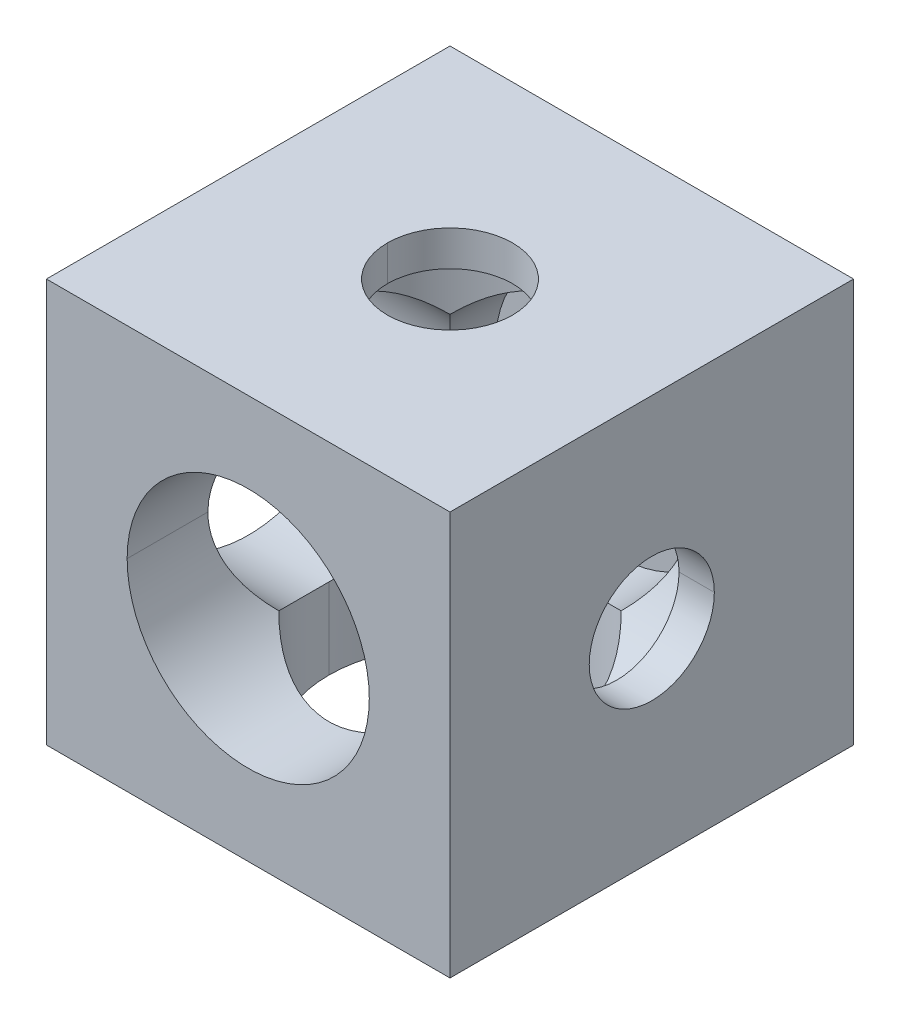
ISO-10303-21;
HEADER;
FILE_DESCRIPTION(('STEP AP214'),'2;1');
FILE_NAME('part.step','',(''),(''),'','','');
FILE_SCHEMA(('AUTOMOTIVE_DESIGN { 1 0 10303 214 1 1 1 1 }'));
ENDSEC;
DATA;
#1=APPLICATION_CONTEXT('core data for automotive mechanical design processes');
#2=APPLICATION_PROTOCOL_DEFINITION('international standard','automotive_design',2000,#1);
#3=PRODUCT_CONTEXT('',#1,'mechanical');
#4=PRODUCT('Part','Part','',(#3));
#5=PRODUCT_RELATED_PRODUCT_CATEGORY('part','',(#4));
#6=PRODUCT_DEFINITION_FORMATION('','',#4);
#7=PRODUCT_DEFINITION_CONTEXT('part definition',#1,'design');
#8=PRODUCT_DEFINITION('design','',#6,#7);
#9=PRODUCT_DEFINITION_SHAPE('','',#8);
#10=(LENGTH_UNIT() NAMED_UNIT(*) SI_UNIT(.MILLI.,.METRE.));
#11=(NAMED_UNIT(*) PLANE_ANGLE_UNIT() SI_UNIT($,.RADIAN.));
#12=(NAMED_UNIT(*) SI_UNIT($,.STERADIAN.) SOLID_ANGLE_UNIT());
#13=UNCERTAINTY_MEASURE_WITH_UNIT(LENGTH_MEASURE(1.E-05),#10,'distance_accuracy_value','');
#14=(GEOMETRIC_REPRESENTATION_CONTEXT(3) GLOBAL_UNCERTAINTY_ASSIGNED_CONTEXT((#13)) GLOBAL_UNIT_ASSIGNED_CONTEXT((#10,
#11,#12)) REPRESENTATION_CONTEXT('',''));
#15=CARTESIAN_POINT('',(0.,0.,0.));
#16=DIRECTION('',(0.,0.,1.));
#17=DIRECTION('',(1.,0.,0.));
#18=AXIS2_PLACEMENT_3D('',#15,#16,#17);
#19=CARTESIAN_POINT('',(-40.,0.,0.));
#20=DIRECTION('',(1.,0.,0.));
#21=DIRECTION('',(0.,1.,0.));
#22=AXIS2_PLACEMENT_3D('',#19,#20,#21);
#23=PLANE('',#22);
#24=CARTESIAN_POINT('',(-40.,0.,0.));
#25=DIRECTION('',(1.,0.,0.));
#26=DIRECTION('',(0.,0.,-1.));
#27=AXIS2_PLACEMENT_3D('',#24,#25,#26);
#28=CIRCLE('',#27,12.);
#29=CARTESIAN_POINT('',(-40.,0.,-12.));
#30=VERTEX_POINT('',#29);
#31=CARTESIAN_POINT('',(-40.,0.,12.));
#32=VERTEX_POINT('',#31);
#33=EDGE_CURVE('E314',#30,#32,#28,.T.);
#34=ORIENTED_EDGE('',*,*,#33,.T.);
#35=CARTESIAN_POINT('',(-40.,0.,0.));
#36=DIRECTION('',(1.,0.,0.));
#37=DIRECTION('',(0.,0.,-1.));
#38=AXIS2_PLACEMENT_3D('',#35,#36,#37);
#39=CIRCLE('',#38,12.);
#40=EDGE_CURVE('E324',#32,#30,#39,.T.);
#41=ORIENTED_EDGE('',*,*,#40,.T.);
#42=EDGE_LOOP('',(#34,#41));
#43=FACE_BOUND('',#42,.T.);
#44=DIRECTION('',(0.,0.,-1.));
#45=VECTOR('',#44,1.);
#46=CARTESIAN_POINT('',(-40.,20.,0.));
#47=LINE('',#46,#45);
#48=CARTESIAN_POINT('',(-40.,20.,20.));
#49=VERTEX_POINT('',#48);
#50=CARTESIAN_POINT('',(-40.,20.,-20.));
#51=VERTEX_POINT('',#50);
#52=EDGE_CURVE('E332',#49,#51,#47,.T.);
#53=ORIENTED_EDGE('',*,*,#52,.T.);
#54=DIRECTION('',(0.,1.,0.));
#55=VECTOR('',#54,1.);
#56=CARTESIAN_POINT('',(-40.,0.,-20.));
#57=LINE('',#56,#55);
#58=CARTESIAN_POINT('',(-40.,-20.,-20.));
#59=VERTEX_POINT('',#58);
#60=EDGE_CURVE('E273',#59,#51,#57,.T.);
#61=ORIENTED_EDGE('',*,*,#60,.F.);
#62=DIRECTION('',(0.,0.,-1.));
#63=VECTOR('',#62,1.);
#64=CARTESIAN_POINT('',(-40.,-20.,0.));
#65=LINE('',#64,#63);
#66=CARTESIAN_POINT('',(-40.,-20.,20.));
#67=VERTEX_POINT('',#66);
#68=EDGE_CURVE('E10',#67,#59,#65,.T.);
#69=ORIENTED_EDGE('',*,*,#68,.F.);
#70=DIRECTION('',(0.,-1.,0.));
#71=VECTOR('',#70,1.);
#72=CARTESIAN_POINT('',(-40.,0.,20.));
#73=LINE('',#72,#71);
#74=EDGE_CURVE('E251',#49,#67,#73,.T.);
#75=ORIENTED_EDGE('',*,*,#74,.F.);
#76=EDGE_LOOP('',(#53,#61,#69,#75));
#77=FACE_BOUND('',#76,.T.);
#78=ADVANCED_FACE('F16',(#43,#77),#23,.F.);
#79=CARTESIAN_POINT('',(-20.,-20.,0.));
#80=DIRECTION('',(0.,1.,0.));
#81=DIRECTION('',(1.,0.,0.));
#82=AXIS2_PLACEMENT_3D('',#79,#80,#81);
#83=PLANE('',#82);
#84=CARTESIAN_POINT('',(-20.,-20.,0.));
#85=DIRECTION('',(0.,1.,0.));
#86=DIRECTION('',(-1.,0.,0.));
#87=AXIS2_PLACEMENT_3D('',#84,#85,#86);
#88=CIRCLE('',#87,12.);
#89=CARTESIAN_POINT('',(-32.,-20.,0.));
#90=VERTEX_POINT('',#89);
#91=CARTESIAN_POINT('',(-8.,-20.,0.));
#92=VERTEX_POINT('',#91);
#93=EDGE_CURVE('E20',#90,#92,#88,.T.);
#94=ORIENTED_EDGE('',*,*,#93,.T.);
#95=CARTESIAN_POINT('',(-20.,-20.,0.));
#96=DIRECTION('',(0.,1.,0.));
#97=DIRECTION('',(-1.,0.,0.));
#98=AXIS2_PLACEMENT_3D('',#95,#96,#97);
#99=CIRCLE('',#98,12.);
#100=EDGE_CURVE('E298',#92,#90,#99,.T.);
#101=ORIENTED_EDGE('',*,*,#100,.T.);
#102=EDGE_LOOP('',(#94,#101));
#103=FACE_BOUND('',#102,.T.);
#104=ORIENTED_EDGE('',*,*,#68,.T.);
#105=DIRECTION('',(-1.,0.,0.));
#106=VECTOR('',#105,1.);
#107=CARTESIAN_POINT('',(-20.,-20.,-20.));
#108=LINE('',#107,#106);
#109=CARTESIAN_POINT('',(0.,-20.,-20.));
#110=VERTEX_POINT('',#109);
#111=EDGE_CURVE('E261',#110,#59,#108,.T.);
#112=ORIENTED_EDGE('',*,*,#111,.F.);
#113=DIRECTION('',(0.,0.,-1.));
#114=VECTOR('',#113,1.);
#115=CARTESIAN_POINT('',(0.,-20.,0.));
#116=LINE('',#115,#114);
#117=CARTESIAN_POINT('',(0.,-20.,20.));
#118=VERTEX_POINT('',#117);
#119=EDGE_CURVE('E27',#118,#110,#116,.T.);
#120=ORIENTED_EDGE('',*,*,#119,.F.);
#121=DIRECTION('',(1.,0.,0.));
#122=VECTOR('',#121,1.);
#123=CARTESIAN_POINT('',(-20.,-20.,20.));
#124=LINE('',#123,#122);
#125=EDGE_CURVE('E255',#67,#118,#124,.T.);
#126=ORIENTED_EDGE('',*,*,#125,.F.);
#127=EDGE_LOOP('',(#104,#112,#120,#126));
#128=FACE_BOUND('',#127,.T.);
#129=ADVANCED_FACE('F547',(#103,#128),#83,.F.);
#130=CARTESIAN_POINT('',(0.,0.,0.));
#131=DIRECTION('',(-1.,0.,0.));
#132=DIRECTION('',(0.,0.,1.));
#133=AXIS2_PLACEMENT_3D('',#130,#131,#132);
#134=PLANE('',#133);
#135=CARTESIAN_POINT('',(0.,0.,0.));
#136=DIRECTION('',(-1.,0.,0.));
#137=DIRECTION('',(0.,0.,-1.));
#138=AXIS2_PLACEMENT_3D('',#135,#136,#137);
#139=CIRCLE('',#138,6.2);
#140=CARTESIAN_POINT('',(0.,0.,-6.2));
#141=VERTEX_POINT('',#140);
#142=CARTESIAN_POINT('',(0.,0.,6.2));
#143=VERTEX_POINT('',#142);
#144=EDGE_CURVE('E357',#141,#143,#139,.T.);
#145=ORIENTED_EDGE('',*,*,#144,.T.);
#146=CARTESIAN_POINT('',(0.,0.,0.));
#147=DIRECTION('',(-1.,0.,0.));
#148=DIRECTION('',(0.,0.,-1.));
#149=AXIS2_PLACEMENT_3D('',#146,#147,#148);
#150=CIRCLE('',#149,6.2);
#151=EDGE_CURVE('E491',#143,#141,#150,.T.);
#152=ORIENTED_EDGE('',*,*,#151,.T.);
#153=EDGE_LOOP('',(#145,#152));
#154=FACE_BOUND('',#153,.T.);
#155=ORIENTED_EDGE('',*,*,#119,.T.);
#156=DIRECTION('',(0.,-1.,0.));
#157=VECTOR('',#156,1.);
#158=CARTESIAN_POINT('',(0.,0.,-20.));
#159=LINE('',#158,#157);
#160=CARTESIAN_POINT('',(0.,20.,-20.));
#161=VERTEX_POINT('',#160);
#162=EDGE_CURVE('E257',#161,#110,#159,.T.);
#163=ORIENTED_EDGE('',*,*,#162,.F.);
#164=DIRECTION('',(0.,0.,-1.));
#165=VECTOR('',#164,1.);
#166=CARTESIAN_POINT('',(0.,20.,0.));
#167=LINE('',#166,#165);
#168=CARTESIAN_POINT('',(0.,20.,20.));
#169=VERTEX_POINT('',#168);
#170=EDGE_CURVE('E329',#169,#161,#167,.T.);
#171=ORIENTED_EDGE('',*,*,#170,.F.);
#172=DIRECTION('',(0.,1.,0.));
#173=VECTOR('',#172,1.);
#174=CARTESIAN_POINT('',(0.,0.,20.));
#175=LINE('',#174,#173);
#176=EDGE_CURVE('E274',#118,#169,#175,.T.);
#177=ORIENTED_EDGE('',*,*,#176,.F.);
#178=EDGE_LOOP('',(#155,#163,#171,#177));
#179=FACE_BOUND('',#178,.T.);
#180=ADVANCED_FACE('F550',(#154,#179),#134,.F.);
#181=CARTESIAN_POINT('',(-20.,20.,0.));
#182=DIRECTION('',(0.,-1.,0.));
#183=DIRECTION('',(0.,0.,-1.));
#184=AXIS2_PLACEMENT_3D('',#181,#182,#183);
#185=PLANE('',#184);
#186=CARTESIAN_POINT('',(-20.,20.,0.));
#187=DIRECTION('',(0.,-1.,0.));
#188=DIRECTION('',(-1.,0.,0.));
#189=AXIS2_PLACEMENT_3D('',#186,#187,#188);
#190=CIRCLE('',#189,6.2);
#191=CARTESIAN_POINT('',(-26.2,20.,0.));
#192=VERTEX_POINT('',#191);
#193=CARTESIAN_POINT('',(-13.8,20.,0.));
#194=VERTEX_POINT('',#193);
#195=EDGE_CURVE('E309',#192,#194,#190,.T.);
#196=ORIENTED_EDGE('',*,*,#195,.T.);
#197=CARTESIAN_POINT('',(-20.,20.,0.));
#198=DIRECTION('',(0.,-1.,0.));
#199=DIRECTION('',(-1.,0.,0.));
#200=AXIS2_PLACEMENT_3D('',#197,#198,#199);
#201=CIRCLE('',#200,6.2);
#202=EDGE_CURVE('E279',#194,#192,#201,.T.);
#203=ORIENTED_EDGE('',*,*,#202,.T.);
#204=EDGE_LOOP('',(#196,#203));
#205=FACE_BOUND('',#204,.T.);
#206=ORIENTED_EDGE('',*,*,#170,.T.);
#207=DIRECTION('',(1.,0.,0.));
#208=VECTOR('',#207,1.);
#209=CARTESIAN_POINT('',(-20.,20.,-20.));
#210=LINE('',#209,#208);
#211=EDGE_CURVE('E262',#51,#161,#210,.T.);
#212=ORIENTED_EDGE('',*,*,#211,.F.);
#213=ORIENTED_EDGE('',*,*,#52,.F.);
#214=DIRECTION('',(-1.,0.,0.));
#215=VECTOR('',#214,1.);
#216=CARTESIAN_POINT('',(-20.,20.,20.));
#217=LINE('',#216,#215);
#218=EDGE_CURVE('E269',#169,#49,#217,.T.);
#219=ORIENTED_EDGE('',*,*,#218,.F.);
#220=EDGE_LOOP('',(#206,#212,#213,#219));
#221=FACE_BOUND('',#220,.T.);
#222=ADVANCED_FACE('F390',(#205,#221),#185,.F.);
#223=CARTESIAN_POINT('',(-20.,0.,-20.));
#224=DIRECTION('',(0.,0.,1.));
#225=DIRECTION('',(1.,0.,0.));
#226=AXIS2_PLACEMENT_3D('',#223,#224,#225);
#227=PLANE('',#226);
#228=CARTESIAN_POINT('',(-20.,0.,-20.));
#229=DIRECTION('',(0.,0.,1.));
#230=DIRECTION('',(-1.,0.,0.));
#231=AXIS2_PLACEMENT_3D('',#228,#229,#230);
#232=CIRCLE('',#231,6.2);
#233=CARTESIAN_POINT('',(-26.2,0.,-20.));
#234=VERTEX_POINT('',#233);
#235=CARTESIAN_POINT('',(-13.8,0.,-20.));
#236=VERTEX_POINT('',#235);
#237=EDGE_CURVE('E256',#234,#236,#232,.T.);
#238=ORIENTED_EDGE('',*,*,#237,.T.);
#239=CARTESIAN_POINT('',(-20.,0.,-20.));
#240=DIRECTION('',(0.,0.,1.));
#241=DIRECTION('',(-1.,0.,0.));
#242=AXIS2_PLACEMENT_3D('',#239,#240,#241);
#243=CIRCLE('',#242,6.2);
#244=EDGE_CURVE('E339',#236,#234,#243,.T.);
#245=ORIENTED_EDGE('',*,*,#244,.T.);
#246=EDGE_LOOP('',(#238,#245));
#247=FACE_BOUND('',#246,.T.);
#248=ORIENTED_EDGE('',*,*,#60,.T.);
#249=ORIENTED_EDGE('',*,*,#211,.T.);
#250=ORIENTED_EDGE('',*,*,#162,.T.);
#251=ORIENTED_EDGE('',*,*,#111,.T.);
#252=EDGE_LOOP('',(#248,#249,#250,#251));
#253=FACE_BOUND('',#252,.T.);
#254=ADVANCED_FACE('F557',(#247,#253),#227,.F.);
#255=CARTESIAN_POINT('',(-20.,0.,20.));
#256=DIRECTION('',(0.,0.,1.));
#257=DIRECTION('',(1.,0.,0.));
#258=AXIS2_PLACEMENT_3D('',#255,#256,#257);
#259=PLANE('',#258);
#260=CARTESIAN_POINT('',(-20.,0.,20.));
#261=DIRECTION('',(0.,0.,-1.));
#262=DIRECTION('',(-1.,0.,0.));
#263=AXIS2_PLACEMENT_3D('',#260,#261,#262);
#264=CIRCLE('',#263,12.);
#265=CARTESIAN_POINT('',(-32.,0.,20.));
#266=VERTEX_POINT('',#265);
#267=CARTESIAN_POINT('',(-8.,0.,20.));
#268=VERTEX_POINT('',#267);
#269=EDGE_CURVE('E296',#266,#268,#264,.T.);
#270=ORIENTED_EDGE('',*,*,#269,.T.);
#271=CARTESIAN_POINT('',(-20.,0.,20.));
#272=DIRECTION('',(0.,0.,-1.));
#273=DIRECTION('',(-1.,0.,0.));
#274=AXIS2_PLACEMENT_3D('',#271,#272,#273);
#275=CIRCLE('',#274,12.);
#276=EDGE_CURVE('E312',#268,#266,#275,.T.);
#277=ORIENTED_EDGE('',*,*,#276,.T.);
#278=EDGE_LOOP('',(#270,#277));
#279=FACE_BOUND('',#278,.T.);
#280=ORIENTED_EDGE('',*,*,#74,.T.);
#281=ORIENTED_EDGE('',*,*,#125,.T.);
#282=ORIENTED_EDGE('',*,*,#176,.T.);
#283=ORIENTED_EDGE('',*,*,#218,.T.);
#284=EDGE_LOOP('',(#280,#281,#282,#283));
#285=FACE_BOUND('',#284,.T.);
#286=ADVANCED_FACE('F611',(#279,#285),#259,.T.);
#287=CARTESIAN_POINT('',(-20.,0.,-18.25));
#288=DIRECTION('',(0.,0.,-1.));
#289=DIRECTION('',(-1.,0.,0.));
#290=AXIS2_PLACEMENT_3D('',#287,#288,#289);
#291=CYLINDRICAL_SURFACE('',#290,6.2);
#292=DIRECTION('',(0.,0.,1.));
#293=VECTOR('',#292,1.);
#294=CARTESIAN_POINT('',(-26.2,0.,-18.25));
#295=LINE('',#294,#293);
#296=CARTESIAN_POINT('',(-26.2,0.,-16.5));
#297=VERTEX_POINT('',#296);
#298=EDGE_CURVE('E344',#234,#297,#295,.T.);
#299=ORIENTED_EDGE('',*,*,#298,.T.);
#300=CARTESIAN_POINT('',(-20.,0.,-16.5));
#301=DIRECTION('',(0.,0.,-1.));
#302=DIRECTION('',(-1.,0.,0.));
#303=AXIS2_PLACEMENT_3D('',#300,#301,#302);
#304=CIRCLE('',#303,6.2);
#305=CARTESIAN_POINT('',(-13.8,0.,-16.5));
#306=VERTEX_POINT('',#305);
#307=EDGE_CURVE('E356',#306,#297,#304,.T.);
#308=ORIENTED_EDGE('',*,*,#307,.F.);
#309=DIRECTION('',(0.,0.,-1.));
#310=VECTOR('',#309,1.);
#311=CARTESIAN_POINT('',(-13.8,0.,-18.25));
#312=LINE('',#311,#310);
#313=EDGE_CURVE('E343',#306,#236,#312,.T.);
#314=ORIENTED_EDGE('',*,*,#313,.T.);
#315=ORIENTED_EDGE('',*,*,#237,.F.);
#316=EDGE_LOOP('',(#299,#308,#314,#315));
#317=FACE_BOUND('',#316,.T.);
#318=ADVANCED_FACE('F601',(#317),#291,.F.);
#319=CARTESIAN_POINT('',(-29.1,0.,-16.5));
#320=DIRECTION('',(0.,0.,-1.));
#321=DIRECTION('',(0.,-1.,0.));
#322=AXIS2_PLACEMENT_3D('',#319,#320,#321);
#323=PLANE('',#322);
#324=CARTESIAN_POINT('',(-20.,0.,-16.5));
#325=DIRECTION('',(0.,0.,-1.));
#326=DIRECTION('',(-1.,0.,0.));
#327=AXIS2_PLACEMENT_3D('',#324,#325,#326);
#328=CIRCLE('',#327,6.2);
#329=EDGE_CURVE('E496',#297,#306,#328,.T.);
#330=ORIENTED_EDGE('',*,*,#329,.T.);
#331=ORIENTED_EDGE('',*,*,#307,.T.);
#332=EDGE_LOOP('',(#330,#331));
#333=FACE_BOUND('',#332,.T.);
#334=CARTESIAN_POINT('',(-20.,0.,-16.5));
#335=DIRECTION('',(0.,0.,-1.));
#336=DIRECTION('',(-1.,0.,0.));
#337=AXIS2_PLACEMENT_3D('',#334,#335,#336);
#338=CIRCLE('',#337,12.);
#339=CARTESIAN_POINT('',(-32.,0.,-16.5));
#340=VERTEX_POINT('',#339);
#341=CARTESIAN_POINT('',(-8.,0.,-16.5));
#342=VERTEX_POINT('',#341);
#343=EDGE_CURVE('E263',#340,#342,#338,.T.);
#344=ORIENTED_EDGE('',*,*,#343,.F.);
#345=CARTESIAN_POINT('',(-20.,0.,-16.5));
#346=DIRECTION('',(0.,0.,-1.));
#347=DIRECTION('',(-1.,0.,0.));
#348=AXIS2_PLACEMENT_3D('',#345,#346,#347);
#349=CIRCLE('',#348,12.);
#350=EDGE_CURVE('E353',#342,#340,#349,.T.);
#351=ORIENTED_EDGE('',*,*,#350,.F.);
#352=EDGE_LOOP('',(#344,#351));
#353=FACE_BOUND('',#352,.T.);
#354=ADVANCED_FACE('F588',(#333,#353),#323,.F.);
#355=CARTESIAN_POINT('',(-20.,0.,1.75));
#356=DIRECTION('',(0.,0.,-1.));
#357=DIRECTION('',(-1.,0.,0.));
#358=AXIS2_PLACEMENT_3D('',#355,#356,#357);
#359=CYLINDRICAL_SURFACE('',#358,12.);
#360=DIRECTION('',(0.,0.,1.));
#361=VECTOR('',#360,1.);
#362=CARTESIAN_POINT('',(-32.,0.,-12.4926406871193));
#363=LINE('',#362,#361);
#364=CARTESIAN_POINT('',(-32.,0.,-12.));
#365=VERTEX_POINT('',#364);
#366=EDGE_CURVE('E268',#340,#365,#363,.T.);
#367=ORIENTED_EDGE('',*,*,#366,.T.);
#368=CARTESIAN_POINT('',(-20.,0.,0.));
#369=DIRECTION('',(-0.707106781186548,0.,0.707106781186548));
#370=DIRECTION('',(-0.707106781186548,0.,-0.707106781186548));
#371=AXIS2_PLACEMENT_3D('',#368,#369,#370);
#372=ELLIPSE('',#371,16.9705627484771,12.);
#373=CARTESIAN_POINT('',(-28.4852813742386,-8.48528137423857,-8.48528137423857));
#374=VERTEX_POINT('',#373);
#375=EDGE_CURVE('E327',#365,#374,#372,.T.);
#376=ORIENTED_EDGE('',*,*,#375,.T.);
#377=CARTESIAN_POINT('',(-20.,0.,0.));
#378=DIRECTION('',(0.,-0.707106781186548,0.707106781186548));
#379=DIRECTION('',(0.,0.707106781186548,0.707106781186548));
#380=AXIS2_PLACEMENT_3D('',#377,#378,#379);
#381=ELLIPSE('',#380,16.9705627484771,12.);
#382=CARTESIAN_POINT('',(-11.5147186257614,-8.48528137423857,-8.48528137423857));
#383=VERTEX_POINT('',#382);
#384=EDGE_CURVE('E321',#374,#383,#381,.T.);
#385=ORIENTED_EDGE('',*,*,#384,.T.);
#386=CARTESIAN_POINT('',(-20.,0.,0.));
#387=DIRECTION('',(0.707106781186548,0.,0.707106781186548));
#388=DIRECTION('',(0.707106781186548,0.,-0.707106781186548));
#389=AXIS2_PLACEMENT_3D('',#386,#387,#388);
#390=ELLIPSE('',#389,16.9705627484771,12.);
#391=CARTESIAN_POINT('',(-8.,0.,-12.));
#392=VERTEX_POINT('',#391);
#393=EDGE_CURVE('E212',#383,#392,#390,.T.);
#394=ORIENTED_EDGE('',*,*,#393,.T.);
#395=DIRECTION('',(0.,0.,-1.));
#396=VECTOR('',#395,1.);
#397=CARTESIAN_POINT('',(-8.,0.,-12.4926406871193));
#398=LINE('',#397,#396);
#399=EDGE_CURVE('E267',#392,#342,#398,.T.);
#400=ORIENTED_EDGE('',*,*,#399,.T.);
#401=ORIENTED_EDGE('',*,*,#350,.T.);
#402=EDGE_LOOP('',(#367,#376,#385,#394,#400,#401));
#403=FACE_BOUND('',#402,.T.);
#404=ADVANCED_FACE('F538',(#403),#359,.F.);
#405=CARTESIAN_POINT('',(-1.75,0.,0.));
#406=DIRECTION('',(1.,0.,0.));
#407=DIRECTION('',(0.,0.,-1.));
#408=AXIS2_PLACEMENT_3D('',#405,#406,#407);
#409=CYLINDRICAL_SURFACE('',#408,6.2);
#410=DIRECTION('',(-1.,0.,0.));
#411=VECTOR('',#410,1.);
#412=CARTESIAN_POINT('',(-1.75,0.,-6.2));
#413=LINE('',#412,#411);
#414=CARTESIAN_POINT('',(-3.5,0.,-6.2));
#415=VERTEX_POINT('',#414);
#416=EDGE_CURVE('E487',#141,#415,#413,.T.);
#417=ORIENTED_EDGE('',*,*,#416,.T.);
#418=CARTESIAN_POINT('',(-3.5,0.,0.));
#419=DIRECTION('',(1.,0.,0.));
#420=DIRECTION('',(0.,0.,-1.));
#421=AXIS2_PLACEMENT_3D('',#418,#419,#420);
#422=CIRCLE('',#421,6.2);
#423=CARTESIAN_POINT('',(-3.5,0.,6.2));
#424=VERTEX_POINT('',#423);
#425=EDGE_CURVE('E371',#424,#415,#422,.T.);
#426=ORIENTED_EDGE('',*,*,#425,.F.);
#427=DIRECTION('',(1.,0.,0.));
#428=VECTOR('',#427,1.);
#429=CARTESIAN_POINT('',(-1.75,0.,6.2));
#430=LINE('',#429,#428);
#431=EDGE_CURVE('E505',#424,#143,#430,.T.);
#432=ORIENTED_EDGE('',*,*,#431,.T.);
#433=ORIENTED_EDGE('',*,*,#144,.F.);
#434=EDGE_LOOP('',(#417,#426,#432,#433));
#435=FACE_BOUND('',#434,.T.);
#436=ADVANCED_FACE('F581',(#435),#409,.F.);
#437=CARTESIAN_POINT('',(-3.5,0.,-9.1));
#438=DIRECTION('',(1.,0.,0.));
#439=DIRECTION('',(0.,1.,0.));
#440=AXIS2_PLACEMENT_3D('',#437,#438,#439);
#441=PLANE('',#440);
#442=CARTESIAN_POINT('',(-3.5,0.,0.));
#443=DIRECTION('',(1.,0.,0.));
#444=DIRECTION('',(0.,0.,-1.));
#445=AXIS2_PLACEMENT_3D('',#442,#443,#444);
#446=CIRCLE('',#445,6.2);
#447=EDGE_CURVE('E283',#415,#424,#446,.T.);
#448=ORIENTED_EDGE('',*,*,#447,.T.);
#449=ORIENTED_EDGE('',*,*,#425,.T.);
#450=EDGE_LOOP('',(#448,#449));
#451=FACE_BOUND('',#450,.T.);
#452=CARTESIAN_POINT('',(-3.5,0.,0.));
#453=DIRECTION('',(1.,0.,0.));
#454=DIRECTION('',(0.,0.,-1.));
#455=AXIS2_PLACEMENT_3D('',#452,#453,#454);
#456=CIRCLE('',#455,12.);
#457=CARTESIAN_POINT('',(-3.5,0.,-12.));
#458=VERTEX_POINT('',#457);
#459=CARTESIAN_POINT('',(-3.5,0.,12.));
#460=VERTEX_POINT('',#459);
#461=EDGE_CURVE('E287',#458,#460,#456,.T.);
#462=ORIENTED_EDGE('',*,*,#461,.F.);
#463=CARTESIAN_POINT('',(-3.5,0.,0.));
#464=DIRECTION('',(1.,0.,0.));
#465=DIRECTION('',(0.,0.,-1.));
#466=AXIS2_PLACEMENT_3D('',#463,#464,#465);
#467=CIRCLE('',#466,12.);
#468=EDGE_CURVE('E328',#460,#458,#467,.T.);
#469=ORIENTED_EDGE('',*,*,#468,.F.);
#470=EDGE_LOOP('',(#462,#469));
#471=FACE_BOUND('',#470,.T.);
#472=ADVANCED_FACE('F437',(#451,#471),#441,.F.);
#473=CARTESIAN_POINT('',(-21.75,0.,0.));
#474=DIRECTION('',(1.,0.,0.));
#475=DIRECTION('',(0.,0.,-1.));
#476=AXIS2_PLACEMENT_3D('',#473,#474,#475);
#477=CYLINDRICAL_SURFACE('',#476,12.);
#478=DIRECTION('',(-1.,0.,0.));
#479=VECTOR('',#478,1.);
#480=CARTESIAN_POINT('',(-34.2426406871193,0.,-12.));
#481=LINE('',#480,#479);
#482=EDGE_CURVE('E280',#365,#30,#481,.T.);
#483=ORIENTED_EDGE('',*,*,#482,.T.);
#484=ORIENTED_EDGE('',*,*,#40,.F.);
#485=DIRECTION('',(1.,0.,0.));
#486=VECTOR('',#485,1.);
#487=CARTESIAN_POINT('',(-34.2426406871193,0.,12.));
#488=LINE('',#487,#486);
#489=CARTESIAN_POINT('',(-32.,0.,12.));
#490=VERTEX_POINT('',#489);
#491=EDGE_CURVE('E206',#32,#490,#488,.T.);
#492=ORIENTED_EDGE('',*,*,#491,.T.);
#493=CARTESIAN_POINT('',(-20.,0.,0.));
#494=DIRECTION('',(-0.707106781186548,0.,-0.707106781186548));
#495=DIRECTION('',(0.707106781186548,0.,-0.707106781186548));
#496=AXIS2_PLACEMENT_3D('',#493,#494,#495);
#497=ELLIPSE('',#496,16.9705627484771,12.);
#498=CARTESIAN_POINT('',(-28.4852813742386,-8.48528137423857,8.48528137423857));
#499=VERTEX_POINT('',#498);
#500=EDGE_CURVE('E197',#499,#490,#497,.T.);
#501=ORIENTED_EDGE('',*,*,#500,.F.);
#502=CARTESIAN_POINT('',(-20.,0.,0.));
#503=DIRECTION('',(0.707106781186548,-0.707106781186548,0.));
#504=DIRECTION('',(-0.707106781186548,-0.707106781186548,0.));
#505=AXIS2_PLACEMENT_3D('',#502,#503,#504);
#506=ELLIPSE('',#505,16.9705627484771,12.);
#507=CARTESIAN_POINT('',(-32.,-12.,0.));
#508=VERTEX_POINT('',#507);
#509=EDGE_CURVE('E203',#499,#508,#506,.T.);
#510=ORIENTED_EDGE('',*,*,#509,.T.);
#511=CARTESIAN_POINT('',(-20.,0.,0.));
#512=DIRECTION('',(0.707106781186548,-0.707106781186548,0.));
#513=DIRECTION('',(-0.707106781186548,-0.707106781186548,0.));
#514=AXIS2_PLACEMENT_3D('',#511,#512,#513);
#515=ELLIPSE('',#514,16.9705627484771,12.);
#516=EDGE_CURVE('E318',#508,#374,#515,.T.);
#517=ORIENTED_EDGE('',*,*,#516,.T.);
#518=ORIENTED_EDGE('',*,*,#375,.F.);
#519=EDGE_LOOP('',(#483,#484,#492,#501,#510,#517,#518));
#520=FACE_BOUND('',#519,.T.);
#521=ADVANCED_FACE('F200',(#520),#477,.F.);
#522=CARTESIAN_POINT('',(-21.75,0.,0.));
#523=DIRECTION('',(1.,0.,0.));
#524=DIRECTION('',(0.,0.,-1.));
#525=AXIS2_PLACEMENT_3D('',#522,#523,#524);
#526=CYLINDRICAL_SURFACE('',#525,12.);
#527=DIRECTION('',(-1.,0.,0.));
#528=VECTOR('',#527,1.);
#529=CARTESIAN_POINT('',(-7.50735931288072,0.,-12.));
#530=LINE('',#529,#528);
#531=EDGE_CURVE('E292',#458,#392,#530,.T.);
#532=ORIENTED_EDGE('',*,*,#531,.T.);
#533=ORIENTED_EDGE('',*,*,#393,.F.);
#534=CARTESIAN_POINT('',(-20.,0.,0.));
#535=DIRECTION('',(-0.707106781186548,-0.707106781186548,0.));
#536=DIRECTION('',(-0.707106781186548,0.707106781186548,0.));
#537=AXIS2_PLACEMENT_3D('',#534,#535,#536);
#538=ELLIPSE('',#537,16.9705627484771,12.);
#539=CARTESIAN_POINT('',(-8.,-12.,0.));
#540=VERTEX_POINT('',#539);
#541=EDGE_CURVE('E301',#383,#540,#538,.T.);
#542=ORIENTED_EDGE('',*,*,#541,.T.);
#543=CARTESIAN_POINT('',(-20.,0.,0.));
#544=DIRECTION('',(-0.707106781186548,-0.707106781186548,0.));
#545=DIRECTION('',(-0.707106781186548,0.707106781186548,0.));
#546=AXIS2_PLACEMENT_3D('',#543,#544,#545);
#547=ELLIPSE('',#546,16.9705627484771,12.);
#548=CARTESIAN_POINT('',(-11.5147186257614,-8.48528137423857,8.48528137423857));
#549=VERTEX_POINT('',#548);
#550=EDGE_CURVE('E223',#540,#549,#547,.T.);
#551=ORIENTED_EDGE('',*,*,#550,.T.);
#552=CARTESIAN_POINT('',(-20.,0.,0.));
#553=DIRECTION('',(0.707106781186548,0.,-0.707106781186548));
#554=DIRECTION('',(-0.707106781186548,0.,-0.707106781186548));
#555=AXIS2_PLACEMENT_3D('',#552,#553,#554);
#556=ELLIPSE('',#555,16.9705627484771,12.);
#557=CARTESIAN_POINT('',(-8.,0.,12.));
#558=VERTEX_POINT('',#557);
#559=EDGE_CURVE('E213',#558,#549,#556,.T.);
#560=ORIENTED_EDGE('',*,*,#559,.F.);
#561=DIRECTION('',(1.,0.,0.));
#562=VECTOR('',#561,1.);
#563=CARTESIAN_POINT('',(-7.50735931288072,0.,12.));
#564=LINE('',#563,#562);
#565=EDGE_CURVE('E291',#558,#460,#564,.T.);
#566=ORIENTED_EDGE('',*,*,#565,.T.);
#567=ORIENTED_EDGE('',*,*,#468,.T.);
#568=EDGE_LOOP('',(#532,#533,#542,#551,#560,#566,#567));
#569=FACE_BOUND('',#568,.T.);
#570=ADVANCED_FACE('F18',(#569),#526,.F.);
#571=CARTESIAN_POINT('',(-20.,0.,1.75));
#572=DIRECTION('',(0.,0.,-1.));
#573=DIRECTION('',(-1.,0.,0.));
#574=AXIS2_PLACEMENT_3D('',#571,#572,#573);
#575=CYLINDRICAL_SURFACE('',#574,12.);
#576=DIRECTION('',(0.,0.,1.));
#577=VECTOR('',#576,1.);
#578=CARTESIAN_POINT('',(-32.,0.,14.2426406871193));
#579=LINE('',#578,#577);
#580=EDGE_CURVE('E363',#490,#266,#579,.T.);
#581=ORIENTED_EDGE('',*,*,#580,.T.);
#582=ORIENTED_EDGE('',*,*,#276,.F.);
#583=DIRECTION('',(0.,0.,-1.));
#584=VECTOR('',#583,1.);
#585=CARTESIAN_POINT('',(-8.,0.,14.2426406871193));
#586=LINE('',#585,#584);
#587=EDGE_CURVE('E293',#268,#558,#586,.T.);
#588=ORIENTED_EDGE('',*,*,#587,.T.);
#589=ORIENTED_EDGE('',*,*,#559,.T.);
#590=CARTESIAN_POINT('',(-20.,0.,0.));
#591=DIRECTION('',(0.,-0.707106781186548,-0.707106781186548));
#592=DIRECTION('',(0.,-0.707106781186548,0.707106781186548));
#593=AXIS2_PLACEMENT_3D('',#590,#591,#592);
#594=ELLIPSE('',#593,16.9705627484771,12.);
#595=EDGE_CURVE('E216',#549,#499,#594,.T.);
#596=ORIENTED_EDGE('',*,*,#595,.T.);
#597=ORIENTED_EDGE('',*,*,#500,.T.);
#598=EDGE_LOOP('',(#581,#582,#588,#589,#596,#597));
#599=FACE_BOUND('',#598,.T.);
#600=ADVANCED_FACE('F217',(#599),#575,.F.);
#601=CARTESIAN_POINT('',(-20.,18.25,0.));
#602=DIRECTION('',(0.,1.,0.));
#603=DIRECTION('',(-1.,0.,0.));
#604=AXIS2_PLACEMENT_3D('',#601,#602,#603);
#605=CYLINDRICAL_SURFACE('',#604,6.2);
#606=DIRECTION('',(0.,-1.,0.));
#607=VECTOR('',#606,1.);
#608=CARTESIAN_POINT('',(-26.2,18.25,0.));
#609=LINE('',#608,#607);
#610=CARTESIAN_POINT('',(-26.2,16.5,0.));
#611=VERTEX_POINT('',#610);
#612=EDGE_CURVE('E349',#192,#611,#609,.T.);
#613=ORIENTED_EDGE('',*,*,#612,.T.);
#614=CARTESIAN_POINT('',(-20.,16.5,0.));
#615=DIRECTION('',(0.,1.,0.));
#616=DIRECTION('',(-1.,0.,0.));
#617=AXIS2_PLACEMENT_3D('',#614,#615,#616);
#618=CIRCLE('',#617,6.2);
#619=CARTESIAN_POINT('',(-13.8,16.5,0.));
#620=VERTEX_POINT('',#619);
#621=EDGE_CURVE('E313',#620,#611,#618,.T.);
#622=ORIENTED_EDGE('',*,*,#621,.F.);
#623=DIRECTION('',(0.,1.,0.));
#624=VECTOR('',#623,1.);
#625=CARTESIAN_POINT('',(-13.8,18.25,0.));
#626=LINE('',#625,#624);
#627=EDGE_CURVE('E275',#620,#194,#626,.T.);
#628=ORIENTED_EDGE('',*,*,#627,.T.);
#629=ORIENTED_EDGE('',*,*,#195,.F.);
#630=EDGE_LOOP('',(#613,#622,#628,#629));
#631=FACE_BOUND('',#630,.T.);
#632=ADVANCED_FACE('F399',(#631),#605,.F.);
#633=CARTESIAN_POINT('',(-29.1,16.5,0.));
#634=DIRECTION('',(0.,1.,0.));
#635=DIRECTION('',(1.,0.,0.));
#636=AXIS2_PLACEMENT_3D('',#633,#634,#635);
#637=PLANE('',#636);
#638=CARTESIAN_POINT('',(-20.,16.5,0.));
#639=DIRECTION('',(0.,1.,0.));
#640=DIRECTION('',(-1.,0.,0.));
#641=AXIS2_PLACEMENT_3D('',#638,#639,#640);
#642=CIRCLE('',#641,6.2);
#643=EDGE_CURVE('E235',#611,#620,#642,.T.);
#644=ORIENTED_EDGE('',*,*,#643,.T.);
#645=ORIENTED_EDGE('',*,*,#621,.T.);
#646=EDGE_LOOP('',(#644,#645));
#647=FACE_BOUND('',#646,.T.);
#648=CARTESIAN_POINT('',(-20.,16.5,0.));
#649=DIRECTION('',(0.,1.,0.));
#650=DIRECTION('',(-1.,0.,0.));
#651=AXIS2_PLACEMENT_3D('',#648,#649,#650);
#652=CIRCLE('',#651,12.);
#653=CARTESIAN_POINT('',(-32.,16.5,0.));
#654=VERTEX_POINT('',#653);
#655=CARTESIAN_POINT('',(-8.,16.5,0.));
#656=VERTEX_POINT('',#655);
#657=EDGE_CURVE('E250',#654,#656,#652,.T.);
#658=ORIENTED_EDGE('',*,*,#657,.F.);
#659=CARTESIAN_POINT('',(-20.,16.5,0.));
#660=DIRECTION('',(0.,1.,0.));
#661=DIRECTION('',(-1.,0.,0.));
#662=AXIS2_PLACEMENT_3D('',#659,#660,#661);
#663=CIRCLE('',#662,12.);
#664=EDGE_CURVE('E302',#656,#654,#663,.T.);
#665=ORIENTED_EDGE('',*,*,#664,.F.);
#666=EDGE_LOOP('',(#658,#665));
#667=FACE_BOUND('',#666,.T.);
#668=ADVANCED_FACE('F592',(#647,#667),#637,.F.);
#669=CARTESIAN_POINT('',(-20.,-1.75,0.));
#670=DIRECTION('',(0.,1.,0.));
#671=DIRECTION('',(-1.,0.,0.));
#672=AXIS2_PLACEMENT_3D('',#669,#670,#671);
#673=CYLINDRICAL_SURFACE('',#672,12.);
#674=DIRECTION('',(0.,-1.,0.));
#675=VECTOR('',#674,1.);
#676=CARTESIAN_POINT('',(-32.,-14.2426406871193,0.));
#677=LINE('',#676,#675);
#678=EDGE_CURVE('E228',#508,#90,#677,.T.);
#679=ORIENTED_EDGE('',*,*,#678,.T.);
#680=ORIENTED_EDGE('',*,*,#100,.F.);
#681=DIRECTION('',(0.,1.,0.));
#682=VECTOR('',#681,1.);
#683=CARTESIAN_POINT('',(-8.,-14.2426406871193,0.));
#684=LINE('',#683,#682);
#685=EDGE_CURVE('E305',#92,#540,#684,.T.);
#686=ORIENTED_EDGE('',*,*,#685,.T.);
#687=ORIENTED_EDGE('',*,*,#541,.F.);
#688=ORIENTED_EDGE('',*,*,#384,.F.);
#689=ORIENTED_EDGE('',*,*,#516,.F.);
#690=EDGE_LOOP('',(#679,#680,#686,#687,#688,#689));
#691=FACE_BOUND('',#690,.T.);
#692=ADVANCED_FACE('F543',(#691),#673,.F.);
#693=CARTESIAN_POINT('',(-20.,-1.75,0.));
#694=DIRECTION('',(0.,1.,0.));
#695=DIRECTION('',(-1.,0.,0.));
#696=AXIS2_PLACEMENT_3D('',#693,#694,#695);
#697=CYLINDRICAL_SURFACE('',#696,12.);
#698=DIRECTION('',(0.,-1.,0.));
#699=VECTOR('',#698,1.);
#700=CARTESIAN_POINT('',(-32.,12.4926406871193,0.));
#701=LINE('',#700,#699);
#702=CARTESIAN_POINT('',(-32.,12.,0.));
#703=VERTEX_POINT('',#702);
#704=EDGE_CURVE('E246',#654,#703,#701,.T.);
#705=ORIENTED_EDGE('',*,*,#704,.T.);
#706=CARTESIAN_POINT('',(-20.,0.,0.));
#707=DIRECTION('',(0.707106781186548,0.707106781186548,0.));
#708=DIRECTION('',(-0.707106781186548,0.707106781186548,0.));
#709=AXIS2_PLACEMENT_3D('',#706,#707,#708);
#710=ELLIPSE('',#709,16.9705627484771,12.);
#711=CARTESIAN_POINT('',(-28.4852813742386,8.48528137423857,-8.48528137423857));
#712=VERTEX_POINT('',#711);
#713=EDGE_CURVE('E245',#712,#703,#710,.T.);
#714=ORIENTED_EDGE('',*,*,#713,.F.);
#715=CARTESIAN_POINT('',(-20.,0.,0.));
#716=DIRECTION('',(0.,0.707106781186548,0.707106781186548));
#717=DIRECTION('',(0.,-0.707106781186548,0.707106781186548));
#718=AXIS2_PLACEMENT_3D('',#715,#716,#717);
#719=ELLIPSE('',#718,16.9705627484771,12.);
#720=CARTESIAN_POINT('',(-11.5147186257614,8.48528137423857,-8.48528137423857));
#721=VERTEX_POINT('',#720);
#722=EDGE_CURVE('E449',#721,#712,#719,.T.);
#723=ORIENTED_EDGE('',*,*,#722,.F.);
#724=CARTESIAN_POINT('',(-20.,0.,0.));
#725=DIRECTION('',(-0.707106781186548,0.707106781186548,0.));
#726=DIRECTION('',(-0.707106781186548,-0.707106781186548,0.));
#727=AXIS2_PLACEMENT_3D('',#724,#725,#726);
#728=ELLIPSE('',#727,16.9705627484771,12.);
#729=CARTESIAN_POINT('',(-8.,12.,0.));
#730=VERTEX_POINT('',#729);
#731=EDGE_CURVE('E377',#730,#721,#728,.T.);
#732=ORIENTED_EDGE('',*,*,#731,.F.);
#733=DIRECTION('',(0.,1.,0.));
#734=VECTOR('',#733,1.);
#735=CARTESIAN_POINT('',(-8.,12.4926406871193,0.));
#736=LINE('',#735,#734);
#737=EDGE_CURVE('E511',#730,#656,#736,.T.);
#738=ORIENTED_EDGE('',*,*,#737,.T.);
#739=ORIENTED_EDGE('',*,*,#664,.T.);
#740=EDGE_LOOP('',(#705,#714,#723,#732,#738,#739));
#741=FACE_BOUND('',#740,.T.);
#742=ADVANCED_FACE('F591',(#741),#697,.F.);
#743=CARTESIAN_POINT('',(-20.,-1.75,0.));
#744=DIRECTION('',(0.,1.,0.));
#745=DIRECTION('',(-1.,0.,0.));
#746=AXIS2_PLACEMENT_3D('',#743,#744,#745);
#747=CYLINDRICAL_SURFACE('',#746,12.);
#748=ORIENTED_EDGE('',*,*,#704,.F.);
#749=ORIENTED_EDGE('',*,*,#657,.T.);
#750=ORIENTED_EDGE('',*,*,#737,.F.);
#751=CARTESIAN_POINT('',(-20.,0.,0.));
#752=DIRECTION('',(-0.707106781186548,0.707106781186548,0.));
#753=DIRECTION('',(-0.707106781186548,-0.707106781186548,0.));
#754=AXIS2_PLACEMENT_3D('',#751,#752,#753);
#755=ELLIPSE('',#754,16.9705627484771,12.);
#756=CARTESIAN_POINT('',(-11.5147186257614,8.48528137423857,8.48528137423857));
#757=VERTEX_POINT('',#756);
#758=EDGE_CURVE('E367',#757,#730,#755,.T.);
#759=ORIENTED_EDGE('',*,*,#758,.F.);
#760=CARTESIAN_POINT('',(-20.,0.,0.));
#761=DIRECTION('',(0.,0.707106781186548,-0.707106781186548));
#762=DIRECTION('',(0.,0.707106781186548,0.707106781186548));
#763=AXIS2_PLACEMENT_3D('',#760,#761,#762);
#764=ELLIPSE('',#763,16.9705627484771,12.);
#765=CARTESIAN_POINT('',(-28.4852813742386,8.48528137423857,8.48528137423857));
#766=VERTEX_POINT('',#765);
#767=EDGE_CURVE('E297',#766,#757,#764,.T.);
#768=ORIENTED_EDGE('',*,*,#767,.F.);
#769=CARTESIAN_POINT('',(-20.,0.,0.));
#770=DIRECTION('',(0.707106781186548,0.707106781186548,0.));
#771=DIRECTION('',(-0.707106781186548,0.707106781186548,0.));
#772=AXIS2_PLACEMENT_3D('',#769,#770,#771);
#773=ELLIPSE('',#772,16.9705627484771,12.);
#774=EDGE_CURVE('E241',#703,#766,#773,.T.);
#775=ORIENTED_EDGE('',*,*,#774,.F.);
#776=EDGE_LOOP('',(#748,#749,#750,#759,#768,#775));
#777=FACE_BOUND('',#776,.T.);
#778=ADVANCED_FACE('F603',(#777),#747,.F.);
#779=CARTESIAN_POINT('',(-20.,-1.75,0.));
#780=DIRECTION('',(0.,1.,0.));
#781=DIRECTION('',(-1.,0.,0.));
#782=AXIS2_PLACEMENT_3D('',#779,#780,#781);
#783=CYLINDRICAL_SURFACE('',#782,12.);
#784=ORIENTED_EDGE('',*,*,#678,.F.);
#785=ORIENTED_EDGE('',*,*,#509,.F.);
#786=ORIENTED_EDGE('',*,*,#595,.F.);
#787=ORIENTED_EDGE('',*,*,#550,.F.);
#788=ORIENTED_EDGE('',*,*,#685,.F.);
#789=ORIENTED_EDGE('',*,*,#93,.F.);
#790=EDGE_LOOP('',(#784,#785,#786,#787,#788,#789));
#791=FACE_BOUND('',#790,.T.);
#792=ADVANCED_FACE('F225',(#791),#783,.F.);
#793=CARTESIAN_POINT('',(-20.,18.25,0.));
#794=DIRECTION('',(0.,1.,0.));
#795=DIRECTION('',(-1.,0.,0.));
#796=AXIS2_PLACEMENT_3D('',#793,#794,#795);
#797=CYLINDRICAL_SURFACE('',#796,6.2);
#798=ORIENTED_EDGE('',*,*,#612,.F.);
#799=ORIENTED_EDGE('',*,*,#202,.F.);
#800=ORIENTED_EDGE('',*,*,#627,.F.);
#801=ORIENTED_EDGE('',*,*,#643,.F.);
#802=EDGE_LOOP('',(#798,#799,#800,#801));
#803=FACE_BOUND('',#802,.T.);
#804=ADVANCED_FACE('F395',(#803),#797,.F.);
#805=CARTESIAN_POINT('',(-20.,0.,1.75));
#806=DIRECTION('',(0.,0.,-1.));
#807=DIRECTION('',(-1.,0.,0.));
#808=AXIS2_PLACEMENT_3D('',#805,#806,#807);
#809=CYLINDRICAL_SURFACE('',#808,12.);
#810=ORIENTED_EDGE('',*,*,#580,.F.);
#811=CARTESIAN_POINT('',(-20.,0.,0.));
#812=DIRECTION('',(-0.707106781186548,0.,-0.707106781186548));
#813=DIRECTION('',(0.707106781186548,0.,-0.707106781186548));
#814=AXIS2_PLACEMENT_3D('',#811,#812,#813);
#815=ELLIPSE('',#814,16.9705627484771,12.);
#816=EDGE_CURVE('E244',#490,#766,#815,.T.);
#817=ORIENTED_EDGE('',*,*,#816,.T.);
#818=ORIENTED_EDGE('',*,*,#767,.T.);
#819=CARTESIAN_POINT('',(-20.,0.,0.));
#820=DIRECTION('',(0.707106781186548,0.,-0.707106781186548));
#821=DIRECTION('',(-0.707106781186548,0.,-0.707106781186548));
#822=AXIS2_PLACEMENT_3D('',#819,#820,#821);
#823=ELLIPSE('',#822,16.9705627484771,12.);
#824=EDGE_CURVE('E348',#757,#558,#823,.T.);
#825=ORIENTED_EDGE('',*,*,#824,.T.);
#826=ORIENTED_EDGE('',*,*,#587,.F.);
#827=ORIENTED_EDGE('',*,*,#269,.F.);
#828=EDGE_LOOP('',(#810,#817,#818,#825,#826,#827));
#829=FACE_BOUND('',#828,.T.);
#830=ADVANCED_FACE('F595',(#829),#809,.F.);
#831=CARTESIAN_POINT('',(-21.75,0.,0.));
#832=DIRECTION('',(1.,0.,0.));
#833=DIRECTION('',(0.,0.,-1.));
#834=AXIS2_PLACEMENT_3D('',#831,#832,#833);
#835=CYLINDRICAL_SURFACE('',#834,12.);
#836=ORIENTED_EDGE('',*,*,#531,.F.);
#837=ORIENTED_EDGE('',*,*,#461,.T.);
#838=ORIENTED_EDGE('',*,*,#565,.F.);
#839=ORIENTED_EDGE('',*,*,#824,.F.);
#840=ORIENTED_EDGE('',*,*,#758,.T.);
#841=ORIENTED_EDGE('',*,*,#731,.T.);
#842=CARTESIAN_POINT('',(-20.,0.,0.));
#843=DIRECTION('',(0.707106781186548,0.,0.707106781186548));
#844=DIRECTION('',(0.707106781186548,0.,-0.707106781186548));
#845=AXIS2_PLACEMENT_3D('',#842,#843,#844);
#846=ELLIPSE('',#845,16.9705627484771,12.);
#847=EDGE_CURVE('E441',#392,#721,#846,.T.);
#848=ORIENTED_EDGE('',*,*,#847,.F.);
#849=EDGE_LOOP('',(#836,#837,#838,#839,#840,#841,#848));
#850=FACE_BOUND('',#849,.T.);
#851=ADVANCED_FACE('F439',(#850),#835,.F.);
#852=CARTESIAN_POINT('',(-21.75,0.,0.));
#853=DIRECTION('',(1.,0.,0.));
#854=DIRECTION('',(0.,0.,-1.));
#855=AXIS2_PLACEMENT_3D('',#852,#853,#854);
#856=CYLINDRICAL_SURFACE('',#855,12.);
#857=ORIENTED_EDGE('',*,*,#482,.F.);
#858=CARTESIAN_POINT('',(-20.,0.,0.));
#859=DIRECTION('',(-0.707106781186548,0.,0.707106781186548));
#860=DIRECTION('',(-0.707106781186548,0.,-0.707106781186548));
#861=AXIS2_PLACEMENT_3D('',#858,#859,#860);
#862=ELLIPSE('',#861,16.9705627484771,12.);
#863=EDGE_CURVE('E239',#712,#365,#862,.T.);
#864=ORIENTED_EDGE('',*,*,#863,.F.);
#865=ORIENTED_EDGE('',*,*,#713,.T.);
#866=ORIENTED_EDGE('',*,*,#774,.T.);
#867=ORIENTED_EDGE('',*,*,#816,.F.);
#868=ORIENTED_EDGE('',*,*,#491,.F.);
#869=ORIENTED_EDGE('',*,*,#33,.F.);
#870=EDGE_LOOP('',(#857,#864,#865,#866,#867,#868,#869));
#871=FACE_BOUND('',#870,.T.);
#872=ADVANCED_FACE('F598',(#871),#856,.F.);
#873=CARTESIAN_POINT('',(-1.75,0.,0.));
#874=DIRECTION('',(1.,0.,0.));
#875=DIRECTION('',(0.,0.,-1.));
#876=AXIS2_PLACEMENT_3D('',#873,#874,#875);
#877=CYLINDRICAL_SURFACE('',#876,6.2);
#878=ORIENTED_EDGE('',*,*,#416,.F.);
#879=ORIENTED_EDGE('',*,*,#151,.F.);
#880=ORIENTED_EDGE('',*,*,#431,.F.);
#881=ORIENTED_EDGE('',*,*,#447,.F.);
#882=EDGE_LOOP('',(#878,#879,#880,#881));
#883=FACE_BOUND('',#882,.T.);
#884=ADVANCED_FACE('F608',(#883),#877,.F.);
#885=CARTESIAN_POINT('',(-20.,0.,1.75));
#886=DIRECTION('',(0.,0.,-1.));
#887=DIRECTION('',(-1.,0.,0.));
#888=AXIS2_PLACEMENT_3D('',#885,#886,#887);
#889=CYLINDRICAL_SURFACE('',#888,12.);
#890=ORIENTED_EDGE('',*,*,#366,.F.);
#891=ORIENTED_EDGE('',*,*,#343,.T.);
#892=ORIENTED_EDGE('',*,*,#399,.F.);
#893=ORIENTED_EDGE('',*,*,#847,.T.);
#894=ORIENTED_EDGE('',*,*,#722,.T.);
#895=ORIENTED_EDGE('',*,*,#863,.T.);
#896=EDGE_LOOP('',(#890,#891,#892,#893,#894,#895));
#897=FACE_BOUND('',#896,.T.);
#898=ADVANCED_FACE('F453',(#897),#889,.F.);
#899=CARTESIAN_POINT('',(-20.,0.,-18.25));
#900=DIRECTION('',(0.,0.,-1.));
#901=DIRECTION('',(-1.,0.,0.));
#902=AXIS2_PLACEMENT_3D('',#899,#900,#901);
#903=CYLINDRICAL_SURFACE('',#902,6.2);
#904=ORIENTED_EDGE('',*,*,#298,.F.);
#905=ORIENTED_EDGE('',*,*,#244,.F.);
#906=ORIENTED_EDGE('',*,*,#313,.F.);
#907=ORIENTED_EDGE('',*,*,#329,.F.);
#908=EDGE_LOOP('',(#904,#905,#906,#907));
#909=FACE_BOUND('',#908,.T.);
#910=ADVANCED_FACE('F862',(#909),#903,.F.);
#911=CLOSED_SHELL('',(#78,#129,#180,#222,#254,#286,#318,#354,#404,#436,#472,#521,#570,#600,#632,
#668,#692,#742,#778,#792,#804,#830,#851,#872,#884,#898,#910));
#912=MANIFOLD_SOLID_BREP('B1',#911);
#913=ADVANCED_BREP_SHAPE_REPRESENTATION('',(#18,#912),#14);
#914=SHAPE_DEFINITION_REPRESENTATION(#9,#913);
ENDSEC;
END-ISO-10303-21;
